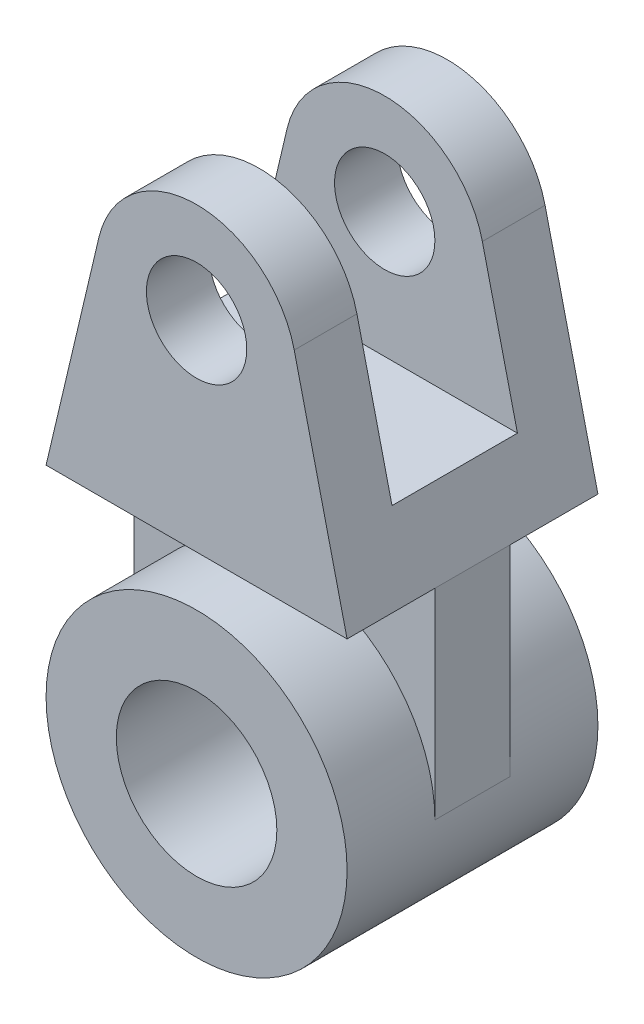
ISO-10303-21;
HEADER;
FILE_DESCRIPTION(('STEP AP214'),'2;1');
FILE_NAME('part.step','',(''),(''),'','','');
FILE_SCHEMA(('AUTOMOTIVE_DESIGN { 1 0 10303 214 1 1 1 1 }'));
ENDSEC;
DATA;
#1=APPLICATION_CONTEXT('core data for automotive mechanical design processes');
#2=APPLICATION_PROTOCOL_DEFINITION('international standard','automotive_design',2000,#1);
#3=PRODUCT_CONTEXT('',#1,'mechanical');
#4=PRODUCT('Part','Part','',(#3));
#5=PRODUCT_RELATED_PRODUCT_CATEGORY('part','',(#4));
#6=PRODUCT_DEFINITION_FORMATION('','',#4);
#7=PRODUCT_DEFINITION_CONTEXT('part definition',#1,'design');
#8=PRODUCT_DEFINITION('design','',#6,#7);
#9=PRODUCT_DEFINITION_SHAPE('','',#8);
#10=(LENGTH_UNIT() NAMED_UNIT(*) SI_UNIT(.MILLI.,.METRE.));
#11=(NAMED_UNIT(*) PLANE_ANGLE_UNIT() SI_UNIT($,.RADIAN.));
#12=(NAMED_UNIT(*) SI_UNIT($,.STERADIAN.) SOLID_ANGLE_UNIT());
#13=UNCERTAINTY_MEASURE_WITH_UNIT(LENGTH_MEASURE(1.E-05),#10,'distance_accuracy_value','');
#14=(GEOMETRIC_REPRESENTATION_CONTEXT(3) GLOBAL_UNCERTAINTY_ASSIGNED_CONTEXT((#13)) GLOBAL_UNIT_ASSIGNED_CONTEXT((#10,
#11,#12)) REPRESENTATION_CONTEXT('',''));
#15=CARTESIAN_POINT('',(0.,0.,0.));
#16=DIRECTION('',(0.,0.,1.));
#17=DIRECTION('',(1.,0.,0.));
#18=AXIS2_PLACEMENT_3D('',#15,#16,#17);
#19=CARTESIAN_POINT('',(0.,55.,-25.));
#20=DIRECTION('',(0.,-1.,0.));
#21=DIRECTION('',(0.,0.,-1.));
#22=AXIS2_PLACEMENT_3D('',#19,#20,#21);
#23=PLANE('',#22);
#24=DIRECTION('',(1.,0.,0.));
#25=VECTOR('',#24,1.);
#26=CARTESIAN_POINT('',(0.,55.,-12.5));
#27=LINE('',#26,#25);
#28=CARTESIAN_POINT('',(-26.4564392373896,55.,-12.5));
#29=VERTEX_POINT('',#28);
#30=CARTESIAN_POINT('',(26.4564392373896,55.,-12.5));
#31=VERTEX_POINT('',#30);
#32=EDGE_CURVE('E126',#29,#31,#27,.T.);
#33=ORIENTED_EDGE('',*,*,#32,.F.);
#34=DIRECTION('',(0.,0.,1.));
#35=VECTOR('',#34,1.);
#36=CARTESIAN_POINT('',(-26.4564392373896,55.,-25.));
#37=LINE('',#36,#35);
#38=CARTESIAN_POINT('',(-26.4564392373896,55.,12.5));
#39=VERTEX_POINT('',#38);
#40=EDGE_CURVE('E144',#29,#39,#37,.T.);
#41=ORIENTED_EDGE('',*,*,#40,.T.);
#42=DIRECTION('',(1.,0.,0.));
#43=VECTOR('',#42,1.);
#44=CARTESIAN_POINT('',(0.,55.,12.5));
#45=LINE('',#44,#43);
#46=CARTESIAN_POINT('',(26.4564392373896,55.,12.5));
#47=VERTEX_POINT('',#46);
#48=EDGE_CURVE('E143',#39,#47,#45,.T.);
#49=ORIENTED_EDGE('',*,*,#48,.T.);
#50=DIRECTION('',(0.,0.,1.));
#51=VECTOR('',#50,1.);
#52=CARTESIAN_POINT('',(26.4564392373896,55.,-25.));
#53=LINE('',#52,#51);
#54=EDGE_CURVE('E50',#31,#47,#53,.T.);
#55=ORIENTED_EDGE('',*,*,#54,.F.);
#56=EDGE_LOOP('',(#33,#41,#49,#55));
#57=FACE_BOUND('',#56,.T.);
#58=ADVANCED_FACE('F35',(#57),#23,.F.);
#59=CARTESIAN_POINT('',(0.,0.,-25.));
#60=DIRECTION('',(0.,0.,1.));
#61=DIRECTION('',(1.,0.,0.));
#62=AXIS2_PLACEMENT_3D('',#59,#60,#61);
#63=CYLINDRICAL_SURFACE('',#62,30.);
#64=CARTESIAN_POINT('',(0.,0.,7.5));
#65=DIRECTION('',(0.,0.,1.));
#66=DIRECTION('',(1.,0.,0.));
#67=AXIS2_PLACEMENT_3D('',#64,#65,#66);
#68=CIRCLE('',#67,30.);
#69=CARTESIAN_POINT('',(30.,0.,7.5));
#70=VERTEX_POINT('',#69);
#71=CARTESIAN_POINT('',(-30.,0.,7.5));
#72=VERTEX_POINT('',#71);
#73=EDGE_CURVE('E154',#70,#72,#68,.T.);
#74=ORIENTED_EDGE('',*,*,#73,.T.);
#75=DIRECTION('',(0.,0.,-1.));
#76=VECTOR('',#75,1.);
#77=CARTESIAN_POINT('',(-30.,0.,7.5));
#78=LINE('',#77,#76);
#79=CARTESIAN_POINT('',(-30.,0.,-7.5));
#80=VERTEX_POINT('',#79);
#81=EDGE_CURVE('E167',#72,#80,#78,.T.);
#82=ORIENTED_EDGE('',*,*,#81,.T.);
#83=CARTESIAN_POINT('',(0.,0.,-7.5));
#84=DIRECTION('',(0.,0.,1.));
#85=DIRECTION('',(1.,0.,0.));
#86=AXIS2_PLACEMENT_3D('',#83,#84,#85);
#87=CIRCLE('',#86,30.);
#88=CARTESIAN_POINT('',(30.,0.,-7.5));
#89=VERTEX_POINT('',#88);
#90=EDGE_CURVE('E168',#89,#80,#87,.T.);
#91=ORIENTED_EDGE('',*,*,#90,.F.);
#92=DIRECTION('',(0.,0.,-1.));
#93=VECTOR('',#92,1.);
#94=CARTESIAN_POINT('',(30.,0.,7.5));
#95=LINE('',#94,#93);
#96=EDGE_CURVE('E183',#70,#89,#95,.T.);
#97=ORIENTED_EDGE('',*,*,#96,.F.);
#98=EDGE_LOOP('',(#74,#82,#91,#97));
#99=FACE_BOUND('',#98,.T.);
#100=CARTESIAN_POINT('',(0.,0.,-25.));
#101=DIRECTION('',(0.,0.,1.));
#102=DIRECTION('',(1.,0.,0.));
#103=AXIS2_PLACEMENT_3D('',#100,#101,#102);
#104=CIRCLE('',#103,30.);
#105=CARTESIAN_POINT('',(30.,0.,-25.));
#106=VERTEX_POINT('',#105);
#107=EDGE_CURVE('E11',#106,#106,#104,.T.);
#108=ORIENTED_EDGE('',*,*,#107,.T.);
#109=EDGE_LOOP('',(#108));
#110=FACE_BOUND('',#109,.T.);
#111=CARTESIAN_POINT('',(0.,0.,25.));
#112=DIRECTION('',(0.,0.,1.));
#113=DIRECTION('',(1.,0.,0.));
#114=AXIS2_PLACEMENT_3D('',#111,#112,#113);
#115=CIRCLE('',#114,30.);
#116=CARTESIAN_POINT('',(30.,0.,25.));
#117=VERTEX_POINT('',#116);
#118=EDGE_CURVE('E39',#117,#117,#115,.T.);
#119=ORIENTED_EDGE('',*,*,#118,.F.);
#120=EDGE_LOOP('',(#119));
#121=FACE_BOUND('',#120,.T.);
#122=ADVANCED_FACE('F37',(#99,#110,#121),#63,.T.);
#123=CARTESIAN_POINT('',(0.,0.,-25.));
#124=DIRECTION('',(0.,0.,1.));
#125=DIRECTION('',(1.,0.,0.));
#126=AXIS2_PLACEMENT_3D('',#123,#124,#125);
#127=PLANE('',#126);
#128=CARTESIAN_POINT('',(0.,0.,-25.));
#129=DIRECTION('',(0.,0.,1.));
#130=DIRECTION('',(1.,0.,0.));
#131=AXIS2_PLACEMENT_3D('',#128,#129,#130);
#132=CIRCLE('',#131,16.);
#133=CARTESIAN_POINT('',(16.,0.,-25.));
#134=VERTEX_POINT('',#133);
#135=EDGE_CURVE('E186',#134,#134,#132,.T.);
#136=ORIENTED_EDGE('',*,*,#135,.T.);
#137=EDGE_LOOP('',(#136));
#138=FACE_BOUND('',#137,.T.);
#139=ORIENTED_EDGE('',*,*,#107,.F.);
#140=EDGE_LOOP('',(#139));
#141=FACE_BOUND('',#140,.T.);
#142=ADVANCED_FACE('F197',(#138,#141),#127,.F.);
#143=CARTESIAN_POINT('',(0.,0.,25.));
#144=DIRECTION('',(0.,0.,1.));
#145=DIRECTION('',(1.,0.,0.));
#146=AXIS2_PLACEMENT_3D('',#143,#144,#145);
#147=PLANE('',#146);
#148=CARTESIAN_POINT('',(0.,0.,25.));
#149=DIRECTION('',(0.,0.,1.));
#150=DIRECTION('',(1.,0.,0.));
#151=AXIS2_PLACEMENT_3D('',#148,#149,#150);
#152=CIRCLE('',#151,16.);
#153=CARTESIAN_POINT('',(16.,0.,25.));
#154=VERTEX_POINT('',#153);
#155=EDGE_CURVE('E185',#154,#154,#152,.T.);
#156=ORIENTED_EDGE('',*,*,#155,.F.);
#157=EDGE_LOOP('',(#156));
#158=FACE_BOUND('',#157,.T.);
#159=ORIENTED_EDGE('',*,*,#118,.T.);
#160=EDGE_LOOP('',(#159));
#161=FACE_BOUND('',#160,.T.);
#162=ADVANCED_FACE('F194',(#158,#161),#147,.T.);
#163=CARTESIAN_POINT('',(0.,0.,-25.));
#164=DIRECTION('',(0.,0.,1.));
#165=DIRECTION('',(1.,0.,0.));
#166=AXIS2_PLACEMENT_3D('',#163,#164,#165);
#167=CYLINDRICAL_SURFACE('',#166,16.);
#168=ORIENTED_EDGE('',*,*,#135,.F.);
#169=EDGE_LOOP('',(#168));
#170=FACE_BOUND('',#169,.T.);
#171=ORIENTED_EDGE('',*,*,#155,.T.);
#172=EDGE_LOOP('',(#171));
#173=FACE_BOUND('',#172,.T.);
#174=ADVANCED_FACE('F192',(#170,#173),#167,.F.);
#175=CARTESIAN_POINT('',(30.,0.,7.5));
#176=DIRECTION('',(-1.,0.,0.));
#177=DIRECTION('',(0.,0.,1.));
#178=AXIS2_PLACEMENT_3D('',#175,#176,#177);
#179=PLANE('',#178);
#180=DIRECTION('',(0.,1.,0.));
#181=VECTOR('',#180,1.);
#182=CARTESIAN_POINT('',(30.,0.,-7.5));
#183=LINE('',#182,#181);
#184=CARTESIAN_POINT('',(30.,40.,-7.5));
#185=VERTEX_POINT('',#184);
#186=EDGE_CURVE('E58',#89,#185,#183,.T.);
#187=ORIENTED_EDGE('',*,*,#186,.T.);
#188=DIRECTION('',(0.,0.,-1.));
#189=VECTOR('',#188,1.);
#190=CARTESIAN_POINT('',(30.,40.,7.5));
#191=LINE('',#190,#189);
#192=CARTESIAN_POINT('',(30.,40.,7.5));
#193=VERTEX_POINT('',#192);
#194=EDGE_CURVE('E180',#193,#185,#191,.T.);
#195=ORIENTED_EDGE('',*,*,#194,.F.);
#196=DIRECTION('',(0.,1.,0.));
#197=VECTOR('',#196,1.);
#198=CARTESIAN_POINT('',(30.,0.,7.5));
#199=LINE('',#198,#197);
#200=EDGE_CURVE('E157',#70,#193,#199,.T.);
#201=ORIENTED_EDGE('',*,*,#200,.F.);
#202=ORIENTED_EDGE('',*,*,#96,.T.);
#203=EDGE_LOOP('',(#187,#195,#201,#202));
#204=FACE_BOUND('',#203,.T.);
#205=ADVANCED_FACE('F339',(#204),#179,.F.);
#206=CARTESIAN_POINT('',(-30.,0.,7.5));
#207=DIRECTION('',(-1.,0.,0.));
#208=DIRECTION('',(0.,0.,1.));
#209=AXIS2_PLACEMENT_3D('',#206,#207,#208);
#210=PLANE('',#209);
#211=DIRECTION('',(0.,1.,0.));
#212=VECTOR('',#211,1.);
#213=CARTESIAN_POINT('',(-30.,0.,-7.5));
#214=LINE('',#213,#212);
#215=CARTESIAN_POINT('',(-30.,40.,-7.5));
#216=VERTEX_POINT('',#215);
#217=EDGE_CURVE('E158',#80,#216,#214,.T.);
#218=ORIENTED_EDGE('',*,*,#217,.F.);
#219=ORIENTED_EDGE('',*,*,#81,.F.);
#220=DIRECTION('',(0.,1.,0.));
#221=VECTOR('',#220,1.);
#222=CARTESIAN_POINT('',(-30.,0.,7.5));
#223=LINE('',#222,#221);
#224=CARTESIAN_POINT('',(-30.,40.,7.5));
#225=VERTEX_POINT('',#224);
#226=EDGE_CURVE('E164',#72,#225,#223,.T.);
#227=ORIENTED_EDGE('',*,*,#226,.T.);
#228=DIRECTION('',(0.,0.,-1.));
#229=VECTOR('',#228,1.);
#230=CARTESIAN_POINT('',(-30.,40.,7.5));
#231=LINE('',#230,#229);
#232=EDGE_CURVE('E178',#225,#216,#231,.T.);
#233=ORIENTED_EDGE('',*,*,#232,.T.);
#234=EDGE_LOOP('',(#218,#219,#227,#233));
#235=FACE_BOUND('',#234,.T.);
#236=ADVANCED_FACE('F222',(#235),#210,.T.);
#237=CARTESIAN_POINT('',(0.,0.,7.5));
#238=DIRECTION('',(0.,0.,1.));
#239=DIRECTION('',(1.,0.,0.));
#240=AXIS2_PLACEMENT_3D('',#237,#238,#239);
#241=PLANE('',#240);
#242=ORIENTED_EDGE('',*,*,#73,.F.);
#243=ORIENTED_EDGE('',*,*,#200,.T.);
#244=DIRECTION('',(1.,0.,0.));
#245=VECTOR('',#244,1.);
#246=CARTESIAN_POINT('',(0.,40.,7.5));
#247=LINE('',#246,#245);
#248=EDGE_CURVE('E161',#225,#193,#247,.T.);
#249=ORIENTED_EDGE('',*,*,#248,.F.);
#250=ORIENTED_EDGE('',*,*,#226,.F.);
#251=EDGE_LOOP('',(#242,#243,#249,#250));
#252=FACE_BOUND('',#251,.T.);
#253=ADVANCED_FACE('F218',(#252),#241,.T.);
#254=CARTESIAN_POINT('',(0.,0.,-7.5));
#255=DIRECTION('',(0.,0.,1.));
#256=DIRECTION('',(1.,0.,0.));
#257=AXIS2_PLACEMENT_3D('',#254,#255,#256);
#258=PLANE('',#257);
#259=ORIENTED_EDGE('',*,*,#90,.T.);
#260=ORIENTED_EDGE('',*,*,#217,.T.);
#261=DIRECTION('',(1.,0.,0.));
#262=VECTOR('',#261,1.);
#263=CARTESIAN_POINT('',(0.,40.,-7.5));
#264=LINE('',#263,#262);
#265=EDGE_CURVE('E172',#216,#185,#264,.T.);
#266=ORIENTED_EDGE('',*,*,#265,.T.);
#267=ORIENTED_EDGE('',*,*,#186,.F.);
#268=EDGE_LOOP('',(#259,#260,#266,#267));
#269=FACE_BOUND('',#268,.T.);
#270=ADVANCED_FACE('F334',(#269),#258,.F.);
#271=CARTESIAN_POINT('',(0.,40.,-25.));
#272=DIRECTION('',(0.,-1.,0.));
#273=DIRECTION('',(0.,0.,-1.));
#274=AXIS2_PLACEMENT_3D('',#271,#272,#273);
#275=PLANE('',#274);
#276=ORIENTED_EDGE('',*,*,#265,.F.);
#277=DIRECTION('',(0.,0.,1.));
#278=VECTOR('',#277,1.);
#279=CARTESIAN_POINT('',(-30.,40.,-25.));
#280=LINE('',#279,#278);
#281=CARTESIAN_POINT('',(-30.,40.,-25.));
#282=VERTEX_POINT('',#281);
#283=EDGE_CURVE('E170',#282,#216,#280,.T.);
#284=ORIENTED_EDGE('',*,*,#283,.F.);
#285=DIRECTION('',(1.,0.,0.));
#286=VECTOR('',#285,1.);
#287=CARTESIAN_POINT('',(0.,40.,-25.));
#288=LINE('',#287,#286);
#289=CARTESIAN_POINT('',(30.,40.,-25.));
#290=VERTEX_POINT('',#289);
#291=EDGE_CURVE('E244',#282,#290,#288,.T.);
#292=ORIENTED_EDGE('',*,*,#291,.T.);
#293=DIRECTION('',(0.,0.,1.));
#294=VECTOR('',#293,1.);
#295=CARTESIAN_POINT('',(30.,40.,-25.));
#296=LINE('',#295,#294);
#297=EDGE_CURVE('E145',#290,#185,#296,.T.);
#298=ORIENTED_EDGE('',*,*,#297,.T.);
#299=EDGE_LOOP('',(#276,#284,#292,#298));
#300=FACE_BOUND('',#299,.T.);
#301=ADVANCED_FACE('F331',(#300),#275,.T.);
#302=CARTESIAN_POINT('',(-30.,40.,25.));
#303=VERTEX_POINT('',#302);
#304=EDGE_CURVE('E147',#225,#303,#280,.T.);
#305=ORIENTED_EDGE('',*,*,#304,.F.);
#306=ORIENTED_EDGE('',*,*,#248,.T.);
#307=CARTESIAN_POINT('',(30.,40.,25.));
#308=VERTEX_POINT('',#307);
#309=EDGE_CURVE('E150',#193,#308,#296,.T.);
#310=ORIENTED_EDGE('',*,*,#309,.T.);
#311=DIRECTION('',(1.,0.,0.));
#312=VECTOR('',#311,1.);
#313=CARTESIAN_POINT('',(0.,40.,25.));
#314=LINE('',#313,#312);
#315=EDGE_CURVE('E229',#303,#308,#314,.T.);
#316=ORIENTED_EDGE('',*,*,#315,.F.);
#317=EDGE_LOOP('',(#305,#306,#310,#316));
#318=FACE_BOUND('',#317,.T.);
#319=ADVANCED_FACE('F226',(#318),#275,.T.);
#320=CARTESIAN_POINT('',(-37.3642665784978,8.82683659808533,-25.));
#321=DIRECTION('',(-0.973212111192934,0.229909083394701,0.));
#322=DIRECTION('',(-0.229909083394701,-0.973212111192934,0.));
#323=AXIS2_PLACEMENT_3D('',#320,#321,#322);
#324=PLANE('',#323);
#325=DIRECTION('',(-0.229909083394701,-0.973212111192934,0.));
#326=VECTOR('',#325,1.);
#327=CARTESIAN_POINT('',(-37.3642665784978,8.82683659808533,25.));
#328=LINE('',#327,#326);
#329=CARTESIAN_POINT('',(-19.4642422238587,84.598181667894,25.));
#330=VERTEX_POINT('',#329);
#331=EDGE_CURVE('E242',#330,#303,#328,.T.);
#332=ORIENTED_EDGE('',*,*,#331,.F.);
#333=DIRECTION('',(0.,0.,1.));
#334=VECTOR('',#333,1.);
#335=CARTESIAN_POINT('',(-19.4642422238587,84.598181667894,12.5));
#336=LINE('',#335,#334);
#337=CARTESIAN_POINT('',(-19.4642422238587,84.598181667894,12.5));
#338=VERTEX_POINT('',#337);
#339=EDGE_CURVE('E248',#338,#330,#336,.T.);
#340=ORIENTED_EDGE('',*,*,#339,.F.);
#341=DIRECTION('',(-0.229909083394701,-0.973212111192934,0.));
#342=VECTOR('',#341,1.);
#343=CARTESIAN_POINT('',(-37.3642665784978,8.82683659808533,12.5));
#344=LINE('',#343,#342);
#345=EDGE_CURVE('E266',#338,#39,#344,.T.);
#346=ORIENTED_EDGE('',*,*,#345,.T.);
#347=ORIENTED_EDGE('',*,*,#40,.F.);
#348=DIRECTION('',(-0.229909083394701,-0.973212111192934,0.));
#349=VECTOR('',#348,1.);
#350=CARTESIAN_POINT('',(-37.3642665784978,8.82683659808533,-12.5));
#351=LINE('',#350,#349);
#352=CARTESIAN_POINT('',(-19.4642422238587,84.598181667894,-12.5));
#353=VERTEX_POINT('',#352);
#354=EDGE_CURVE('E131',#353,#29,#351,.T.);
#355=ORIENTED_EDGE('',*,*,#354,.F.);
#356=DIRECTION('',(0.,0.,-1.));
#357=VECTOR('',#356,1.);
#358=CARTESIAN_POINT('',(-19.4642422238587,84.598181667894,-12.5));
#359=LINE('',#358,#357);
#360=CARTESIAN_POINT('',(-19.4642422238587,84.598181667894,-25.));
#361=VERTEX_POINT('',#360);
#362=EDGE_CURVE('E276',#353,#361,#359,.T.);
#363=ORIENTED_EDGE('',*,*,#362,.T.);
#364=DIRECTION('',(-0.229909083394701,-0.973212111192934,0.));
#365=VECTOR('',#364,1.);
#366=CARTESIAN_POINT('',(-37.3642665784978,8.82683659808533,-25.));
#367=LINE('',#366,#365);
#368=EDGE_CURVE('E236',#361,#282,#367,.T.);
#369=ORIENTED_EDGE('',*,*,#368,.T.);
#370=ORIENTED_EDGE('',*,*,#283,.T.);
#371=ORIENTED_EDGE('',*,*,#232,.F.);
#372=ORIENTED_EDGE('',*,*,#304,.T.);
#373=EDGE_LOOP('',(#332,#340,#346,#347,#355,#363,#369,#370,#371,#372));
#374=FACE_BOUND('',#373,.T.);
#375=ADVANCED_FACE('F233',(#374),#324,.T.);
#376=CARTESIAN_POINT('',(37.3642665784978,8.82683659808534,-25.));
#377=DIRECTION('',(0.973212111192934,0.229909083394701,0.));
#378=DIRECTION('',(-0.229909083394701,0.973212111192934,0.));
#379=AXIS2_PLACEMENT_3D('',#376,#377,#378);
#380=PLANE('',#379);
#381=DIRECTION('',(-0.229909083394701,0.973212111192934,0.));
#382=VECTOR('',#381,1.);
#383=CARTESIAN_POINT('',(37.3642665784978,8.82683659808534,25.));
#384=LINE('',#383,#382);
#385=CARTESIAN_POINT('',(19.4642422238587,84.598181667894,25.));
#386=VERTEX_POINT('',#385);
#387=EDGE_CURVE('E245',#308,#386,#384,.T.);
#388=ORIENTED_EDGE('',*,*,#387,.F.);
#389=ORIENTED_EDGE('',*,*,#309,.F.);
#390=ORIENTED_EDGE('',*,*,#194,.T.);
#391=ORIENTED_EDGE('',*,*,#297,.F.);
#392=DIRECTION('',(-0.229909083394701,0.973212111192934,0.));
#393=VECTOR('',#392,1.);
#394=CARTESIAN_POINT('',(37.3642665784978,8.82683659808534,-25.));
#395=LINE('',#394,#393);
#396=CARTESIAN_POINT('',(19.4642422238587,84.598181667894,-25.));
#397=VERTEX_POINT('',#396);
#398=EDGE_CURVE('E250',#290,#397,#395,.T.);
#399=ORIENTED_EDGE('',*,*,#398,.T.);
#400=DIRECTION('',(0.,0.,-1.));
#401=VECTOR('',#400,1.);
#402=CARTESIAN_POINT('',(19.4642422238587,84.598181667894,-12.5));
#403=LINE('',#402,#401);
#404=CARTESIAN_POINT('',(19.4642422238587,84.598181667894,-12.5));
#405=VERTEX_POINT('',#404);
#406=EDGE_CURVE('E138',#405,#397,#403,.T.);
#407=ORIENTED_EDGE('',*,*,#406,.F.);
#408=DIRECTION('',(-0.229909083394701,0.973212111192934,0.));
#409=VECTOR('',#408,1.);
#410=CARTESIAN_POINT('',(37.3642665784978,8.82683659808534,-12.5));
#411=LINE('',#410,#409);
#412=EDGE_CURVE('E128',#31,#405,#411,.T.);
#413=ORIENTED_EDGE('',*,*,#412,.F.);
#414=ORIENTED_EDGE('',*,*,#54,.T.);
#415=DIRECTION('',(-0.229909083394701,0.973212111192934,0.));
#416=VECTOR('',#415,1.);
#417=CARTESIAN_POINT('',(37.3642665784978,8.82683659808534,12.5));
#418=LINE('',#417,#416);
#419=CARTESIAN_POINT('',(19.4642422238587,84.598181667894,12.5));
#420=VERTEX_POINT('',#419);
#421=EDGE_CURVE('E272',#47,#420,#418,.T.);
#422=ORIENTED_EDGE('',*,*,#421,.T.);
#423=DIRECTION('',(0.,0.,1.));
#424=VECTOR('',#423,1.);
#425=CARTESIAN_POINT('',(19.4642422238587,84.598181667894,12.5));
#426=LINE('',#425,#424);
#427=EDGE_CURVE('E253',#420,#386,#426,.T.);
#428=ORIENTED_EDGE('',*,*,#427,.T.);
#429=EDGE_LOOP('',(#388,#389,#390,#391,#399,#407,#413,#414,#422,#428));
#430=FACE_BOUND('',#429,.T.);
#431=ADVANCED_FACE('F136',(#430),#380,.T.);
#432=CARTESIAN_POINT('',(0.,0.,-25.));
#433=DIRECTION('',(0.,0.,1.));
#434=DIRECTION('',(1.,0.,0.));
#435=AXIS2_PLACEMENT_3D('',#432,#433,#434);
#436=PLANE('',#435);
#437=ORIENTED_EDGE('',*,*,#291,.F.);
#438=ORIENTED_EDGE('',*,*,#368,.F.);
#439=CARTESIAN_POINT('',(0.,80.,-25.));
#440=DIRECTION('',(0.,0.,1.));
#441=DIRECTION('',(1.,0.,0.));
#442=AXIS2_PLACEMENT_3D('',#439,#440,#441);
#443=CIRCLE('',#442,20.);
#444=EDGE_CURVE('E280',#397,#361,#443,.T.);
#445=ORIENTED_EDGE('',*,*,#444,.F.);
#446=ORIENTED_EDGE('',*,*,#398,.F.);
#447=EDGE_LOOP('',(#437,#438,#445,#446));
#448=FACE_BOUND('',#447,.T.);
#449=CARTESIAN_POINT('',(0.,80.,-25.));
#450=DIRECTION('',(0.,0.,1.));
#451=DIRECTION('',(1.,0.,0.));
#452=AXIS2_PLACEMENT_3D('',#449,#450,#451);
#453=CIRCLE('',#452,9.99999999999999);
#454=CARTESIAN_POINT('',(9.99999999999999,80.,-25.));
#455=VERTEX_POINT('',#454);
#456=EDGE_CURVE('E283',#455,#455,#453,.T.);
#457=ORIENTED_EDGE('',*,*,#456,.T.);
#458=EDGE_LOOP('',(#457));
#459=FACE_BOUND('',#458,.T.);
#460=ADVANCED_FACE('F318',(#448,#459),#436,.F.);
#461=CARTESIAN_POINT('',(0.,0.,25.));
#462=DIRECTION('',(0.,0.,1.));
#463=DIRECTION('',(1.,0.,0.));
#464=AXIS2_PLACEMENT_3D('',#461,#462,#463);
#465=PLANE('',#464);
#466=ORIENTED_EDGE('',*,*,#315,.T.);
#467=ORIENTED_EDGE('',*,*,#387,.T.);
#468=CARTESIAN_POINT('',(0.,80.,25.));
#469=DIRECTION('',(0.,0.,1.));
#470=DIRECTION('',(1.,0.,0.));
#471=AXIS2_PLACEMENT_3D('',#468,#469,#470);
#472=CIRCLE('',#471,20.);
#473=EDGE_CURVE('E258',#386,#330,#472,.T.);
#474=ORIENTED_EDGE('',*,*,#473,.T.);
#475=ORIENTED_EDGE('',*,*,#331,.T.);
#476=EDGE_LOOP('',(#466,#467,#474,#475));
#477=FACE_BOUND('',#476,.T.);
#478=CARTESIAN_POINT('',(0.,80.,25.));
#479=DIRECTION('',(0.,0.,1.));
#480=DIRECTION('',(1.,0.,0.));
#481=AXIS2_PLACEMENT_3D('',#478,#479,#480);
#482=CIRCLE('',#481,9.99999999999999);
#483=CARTESIAN_POINT('',(9.99999999999999,80.,25.));
#484=VERTEX_POINT('',#483);
#485=EDGE_CURVE('E262',#484,#484,#482,.T.);
#486=ORIENTED_EDGE('',*,*,#485,.F.);
#487=EDGE_LOOP('',(#486));
#488=FACE_BOUND('',#487,.T.);
#489=ADVANCED_FACE('F316',(#477,#488),#465,.T.);
#490=CARTESIAN_POINT('',(0.,80.,12.5));
#491=DIRECTION('',(0.,0.,1.));
#492=DIRECTION('',(1.,0.,0.));
#493=AXIS2_PLACEMENT_3D('',#490,#491,#492);
#494=CYLINDRICAL_SURFACE('',#493,9.99999999999999);
#495=CARTESIAN_POINT('',(0.,80.,12.5));
#496=DIRECTION('',(0.,0.,1.));
#497=DIRECTION('',(1.,0.,0.));
#498=AXIS2_PLACEMENT_3D('',#495,#496,#497);
#499=CIRCLE('',#498,9.99999999999999);
#500=CARTESIAN_POINT('',(9.99999999999999,80.,12.5));
#501=VERTEX_POINT('',#500);
#502=EDGE_CURVE('E261',#501,#501,#499,.T.);
#503=ORIENTED_EDGE('',*,*,#502,.F.);
#504=EDGE_LOOP('',(#503));
#505=FACE_BOUND('',#504,.T.);
#506=ORIENTED_EDGE('',*,*,#485,.T.);
#507=EDGE_LOOP('',(#506));
#508=FACE_BOUND('',#507,.T.);
#509=ADVANCED_FACE('F312',(#505,#508),#494,.F.);
#510=CARTESIAN_POINT('',(0.,80.,12.5));
#511=DIRECTION('',(0.,0.,1.));
#512=DIRECTION('',(1.,0.,0.));
#513=AXIS2_PLACEMENT_3D('',#510,#511,#512);
#514=CYLINDRICAL_SURFACE('',#513,20.);
#515=ORIENTED_EDGE('',*,*,#473,.F.);
#516=ORIENTED_EDGE('',*,*,#427,.F.);
#517=CARTESIAN_POINT('',(0.,80.,12.5));
#518=DIRECTION('',(0.,0.,1.));
#519=DIRECTION('',(1.,0.,0.));
#520=AXIS2_PLACEMENT_3D('',#517,#518,#519);
#521=CIRCLE('',#520,20.);
#522=EDGE_CURVE('E269',#420,#338,#521,.T.);
#523=ORIENTED_EDGE('',*,*,#522,.T.);
#524=ORIENTED_EDGE('',*,*,#339,.T.);
#525=EDGE_LOOP('',(#515,#516,#523,#524));
#526=FACE_BOUND('',#525,.T.);
#527=ADVANCED_FACE('F308',(#526),#514,.T.);
#528=CARTESIAN_POINT('',(0.,0.,12.5));
#529=DIRECTION('',(0.,0.,1.));
#530=DIRECTION('',(1.,0.,0.));
#531=AXIS2_PLACEMENT_3D('',#528,#529,#530);
#532=PLANE('',#531);
#533=ORIENTED_EDGE('',*,*,#502,.T.);
#534=EDGE_LOOP('',(#533));
#535=FACE_BOUND('',#534,.T.);
#536=ORIENTED_EDGE('',*,*,#421,.F.);
#537=ORIENTED_EDGE('',*,*,#48,.F.);
#538=ORIENTED_EDGE('',*,*,#345,.F.);
#539=ORIENTED_EDGE('',*,*,#522,.F.);
#540=EDGE_LOOP('',(#536,#537,#538,#539));
#541=FACE_BOUND('',#540,.T.);
#542=ADVANCED_FACE('F303',(#535,#541),#532,.F.);
#543=CARTESIAN_POINT('',(0.,80.,-12.5));
#544=DIRECTION('',(0.,0.,-1.));
#545=DIRECTION('',(-1.,0.,0.));
#546=AXIS2_PLACEMENT_3D('',#543,#544,#545);
#547=CYLINDRICAL_SURFACE('',#546,20.);
#548=ORIENTED_EDGE('',*,*,#444,.T.);
#549=ORIENTED_EDGE('',*,*,#362,.F.);
#550=CARTESIAN_POINT('',(0.,80.,-12.5));
#551=DIRECTION('',(0.,0.,1.));
#552=DIRECTION('',(1.,0.,0.));
#553=AXIS2_PLACEMENT_3D('',#550,#551,#552);
#554=CIRCLE('',#553,20.);
#555=EDGE_CURVE('E278',#405,#353,#554,.T.);
#556=ORIENTED_EDGE('',*,*,#555,.F.);
#557=ORIENTED_EDGE('',*,*,#406,.T.);
#558=EDGE_LOOP('',(#548,#549,#556,#557));
#559=FACE_BOUND('',#558,.T.);
#560=ADVANCED_FACE('F299',(#559),#547,.T.);
#561=CARTESIAN_POINT('',(0.,80.,-12.5));
#562=DIRECTION('',(0.,0.,-1.));
#563=DIRECTION('',(-1.,0.,0.));
#564=AXIS2_PLACEMENT_3D('',#561,#562,#563);
#565=CYLINDRICAL_SURFACE('',#564,9.99999999999999);
#566=CARTESIAN_POINT('',(0.,80.,-12.5));
#567=DIRECTION('',(0.,0.,1.));
#568=DIRECTION('',(1.,0.,0.));
#569=AXIS2_PLACEMENT_3D('',#566,#567,#568);
#570=CIRCLE('',#569,9.99999999999999);
#571=CARTESIAN_POINT('',(9.99999999999999,80.,-12.5));
#572=VERTEX_POINT('',#571);
#573=EDGE_CURVE('E139',#572,#572,#570,.T.);
#574=ORIENTED_EDGE('',*,*,#573,.T.);
#575=EDGE_LOOP('',(#574));
#576=FACE_BOUND('',#575,.T.);
#577=ORIENTED_EDGE('',*,*,#456,.F.);
#578=EDGE_LOOP('',(#577));
#579=FACE_BOUND('',#578,.T.);
#580=ADVANCED_FACE('F291',(#576,#579),#565,.F.);
#581=CARTESIAN_POINT('',(0.,0.,-12.5));
#582=DIRECTION('',(0.,0.,-1.));
#583=DIRECTION('',(1.,0.,0.));
#584=AXIS2_PLACEMENT_3D('',#581,#582,#583);
#585=PLANE('',#584);
#586=ORIENTED_EDGE('',*,*,#573,.F.);
#587=EDGE_LOOP('',(#586));
#588=FACE_BOUND('',#587,.T.);
#589=ORIENTED_EDGE('',*,*,#412,.T.);
#590=ORIENTED_EDGE('',*,*,#555,.T.);
#591=ORIENTED_EDGE('',*,*,#354,.T.);
#592=ORIENTED_EDGE('',*,*,#32,.T.);
#593=EDGE_LOOP('',(#589,#590,#591,#592));
#594=FACE_BOUND('',#593,.T.);
#595=ADVANCED_FACE('F127',(#588,#594),#585,.F.);
#596=CLOSED_SHELL('',(#58,#122,#142,#162,#174,#205,#236,#253,#270,#301,#319,#375,#431,#460,#489,
#509,#527,#542,#560,#580,#595));
#597=MANIFOLD_SOLID_BREP('B2',#596);
#598=ADVANCED_BREP_SHAPE_REPRESENTATION('',(#18,#597),#14);
#599=SHAPE_DEFINITION_REPRESENTATION(#9,#598);
ENDSEC;
END-ISO-10303-21;
